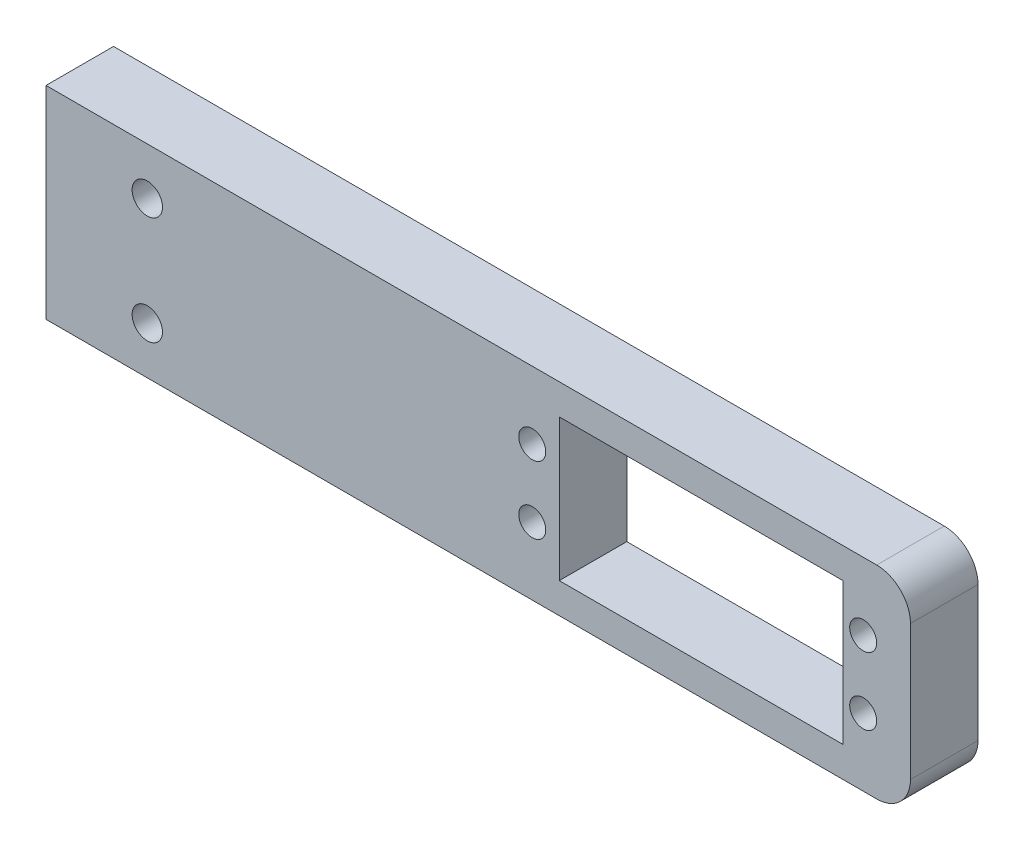
ISO-10303-21;
HEADER;
FILE_DESCRIPTION(('STEP AP214'),'2;1');
FILE_NAME('part.step','',(''),(''),'','','');
FILE_SCHEMA(('AUTOMOTIVE_DESIGN { 1 0 10303 214 1 1 1 1 }'));
ENDSEC;
DATA;
#1=APPLICATION_CONTEXT('core data for automotive mechanical design processes');
#2=APPLICATION_PROTOCOL_DEFINITION('international standard','automotive_design',2000,#1);
#3=PRODUCT_CONTEXT('',#1,'mechanical');
#4=PRODUCT('Part','Part','',(#3));
#5=PRODUCT_RELATED_PRODUCT_CATEGORY('part','',(#4));
#6=PRODUCT_DEFINITION_FORMATION('','',#4);
#7=PRODUCT_DEFINITION_CONTEXT('part definition',#1,'design');
#8=PRODUCT_DEFINITION('design','',#6,#7);
#9=PRODUCT_DEFINITION_SHAPE('','',#8);
#10=(LENGTH_UNIT() NAMED_UNIT(*) SI_UNIT(.MILLI.,.METRE.));
#11=(NAMED_UNIT(*) PLANE_ANGLE_UNIT() SI_UNIT($,.RADIAN.));
#12=(NAMED_UNIT(*) SI_UNIT($,.STERADIAN.) SOLID_ANGLE_UNIT());
#13=UNCERTAINTY_MEASURE_WITH_UNIT(LENGTH_MEASURE(1.E-05),#10,'distance_accuracy_value','');
#14=(GEOMETRIC_REPRESENTATION_CONTEXT(3) GLOBAL_UNCERTAINTY_ASSIGNED_CONTEXT((#13)) GLOBAL_UNIT_ASSIGNED_CONTEXT((#10,
#11,#12)) REPRESENTATION_CONTEXT('',''));
#15=CARTESIAN_POINT('',(0.,0.,0.));
#16=DIRECTION('',(0.,0.,1.));
#17=DIRECTION('',(1.,0.,0.));
#18=AXIS2_PLACEMENT_3D('',#15,#16,#17);
#19=CARTESIAN_POINT('',(0.,0.,10.));
#20=DIRECTION('',(1.,0.,0.));
#21=DIRECTION('',(0.,0.,-1.));
#22=AXIS2_PLACEMENT_3D('',#19,#20,#21);
#23=PLANE('',#22);
#24=DIRECTION('',(0.,-1.,0.));
#25=VECTOR('',#24,1.);
#26=CARTESIAN_POINT('',(0.,0.,0.));
#27=LINE('',#26,#25);
#28=CARTESIAN_POINT('',(0.,30.,0.));
#29=VERTEX_POINT('',#28);
#30=CARTESIAN_POINT('',(0.,0.,0.));
#31=VERTEX_POINT('',#30);
#32=EDGE_CURVE('E171',#29,#31,#27,.T.);
#33=ORIENTED_EDGE('',*,*,#32,.T.);
#34=DIRECTION('',(0.,0.,-1.));
#35=VECTOR('',#34,1.);
#36=CARTESIAN_POINT('',(0.,0.,10.));
#37=LINE('',#36,#35);
#38=CARTESIAN_POINT('',(0.,0.,10.));
#39=VERTEX_POINT('',#38);
#40=EDGE_CURVE('E207',#39,#31,#37,.T.);
#41=ORIENTED_EDGE('',*,*,#40,.F.);
#42=DIRECTION('',(0.,-1.,0.));
#43=VECTOR('',#42,1.);
#44=CARTESIAN_POINT('',(0.,0.,10.));
#45=LINE('',#44,#43);
#46=CARTESIAN_POINT('',(0.,30.,10.));
#47=VERTEX_POINT('',#46);
#48=EDGE_CURVE('E177',#47,#39,#45,.T.);
#49=ORIENTED_EDGE('',*,*,#48,.F.);
#50=DIRECTION('',(0.,0.,-1.));
#51=VECTOR('',#50,1.);
#52=CARTESIAN_POINT('',(0.,30.,10.));
#53=LINE('',#52,#51);
#54=EDGE_CURVE('E191',#47,#29,#53,.T.);
#55=ORIENTED_EDGE('',*,*,#54,.T.);
#56=EDGE_LOOP('',(#33,#41,#49,#55));
#57=FACE_BOUND('',#56,.T.);
#58=ADVANCED_FACE('F38',(#57),#23,.F.);
#59=CARTESIAN_POINT('',(0.,0.,10.));
#60=DIRECTION('',(0.,1.,0.));
#61=DIRECTION('',(0.,0.,1.));
#62=AXIS2_PLACEMENT_3D('',#59,#60,#61);
#63=PLANE('',#62);
#64=DIRECTION('',(1.,0.,0.));
#65=VECTOR('',#64,1.);
#66=CARTESIAN_POINT('',(0.,0.,0.));
#67=LINE('',#66,#65);
#68=CARTESIAN_POINT('',(123.,0.,0.));
#69=VERTEX_POINT('',#68);
#70=EDGE_CURVE('E195',#31,#69,#67,.T.);
#71=ORIENTED_EDGE('',*,*,#70,.T.);
#72=DIRECTION('',(0.,0.,-1.));
#73=VECTOR('',#72,1.);
#74=CARTESIAN_POINT('',(123.,0.,10.));
#75=LINE('',#74,#73);
#76=CARTESIAN_POINT('',(123.,0.,10.));
#77=VERTEX_POINT('',#76);
#78=EDGE_CURVE('E62',#69,#77,#75,.F.);
#79=ORIENTED_EDGE('',*,*,#78,.T.);
#80=DIRECTION('',(1.,0.,0.));
#81=VECTOR('',#80,1.);
#82=CARTESIAN_POINT('',(0.,0.,10.));
#83=LINE('',#82,#81);
#84=EDGE_CURVE('E181',#39,#77,#83,.T.);
#85=ORIENTED_EDGE('',*,*,#84,.F.);
#86=ORIENTED_EDGE('',*,*,#40,.T.);
#87=EDGE_LOOP('',(#71,#79,#85,#86));
#88=FACE_BOUND('',#87,.T.);
#89=ADVANCED_FACE('F240',(#88),#63,.F.);
#90=CARTESIAN_POINT('',(128.,0.,10.));
#91=DIRECTION('',(-1.,0.,0.));
#92=DIRECTION('',(0.,0.,1.));
#93=AXIS2_PLACEMENT_3D('',#90,#91,#92);
#94=PLANE('',#93);
#95=DIRECTION('',(0.,1.,0.));
#96=VECTOR('',#95,1.);
#97=CARTESIAN_POINT('',(128.,0.,10.));
#98=LINE('',#97,#96);
#99=CARTESIAN_POINT('',(128.,5.,10.));
#100=VERTEX_POINT('',#99);
#101=CARTESIAN_POINT('',(128.,25.,10.));
#102=VERTEX_POINT('',#101);
#103=EDGE_CURVE('E185',#100,#102,#98,.T.);
#104=ORIENTED_EDGE('',*,*,#103,.F.);
#105=DIRECTION('',(0.,0.,-1.));
#106=VECTOR('',#105,1.);
#107=CARTESIAN_POINT('',(128.,5.,10.));
#108=LINE('',#107,#106);
#109=CARTESIAN_POINT('',(128.,5.,0.));
#110=VERTEX_POINT('',#109);
#111=EDGE_CURVE('E214',#100,#110,#108,.T.);
#112=ORIENTED_EDGE('',*,*,#111,.T.);
#113=DIRECTION('',(0.,1.,0.));
#114=VECTOR('',#113,1.);
#115=CARTESIAN_POINT('',(128.,0.,0.));
#116=LINE('',#115,#114);
#117=CARTESIAN_POINT('',(128.,25.,0.));
#118=VERTEX_POINT('',#117);
#119=EDGE_CURVE('E198',#110,#118,#116,.T.);
#120=ORIENTED_EDGE('',*,*,#119,.T.);
#121=DIRECTION('',(0.,0.,-1.));
#122=VECTOR('',#121,1.);
#123=CARTESIAN_POINT('',(128.,25.,10.));
#124=LINE('',#123,#122);
#125=EDGE_CURVE('E211',#118,#102,#124,.F.);
#126=ORIENTED_EDGE('',*,*,#125,.T.);
#127=EDGE_LOOP('',(#104,#112,#120,#126));
#128=FACE_BOUND('',#127,.T.);
#129=ADVANCED_FACE('F233',(#128),#94,.F.);
#130=CARTESIAN_POINT('',(0.,30.,10.));
#131=DIRECTION('',(0.,-1.,0.));
#132=DIRECTION('',(0.,0.,-1.));
#133=AXIS2_PLACEMENT_3D('',#130,#131,#132);
#134=PLANE('',#133);
#135=DIRECTION('',(-1.,0.,0.));
#136=VECTOR('',#135,1.);
#137=CARTESIAN_POINT('',(0.,30.,10.));
#138=LINE('',#137,#136);
#139=CARTESIAN_POINT('',(123.,30.,10.));
#140=VERTEX_POINT('',#139);
#141=EDGE_CURVE('E188',#140,#47,#138,.T.);
#142=ORIENTED_EDGE('',*,*,#141,.F.);
#143=DIRECTION('',(0.,0.,-1.));
#144=VECTOR('',#143,1.);
#145=CARTESIAN_POINT('',(123.,30.,10.));
#146=LINE('',#145,#144);
#147=CARTESIAN_POINT('',(123.,30.,0.));
#148=VERTEX_POINT('',#147);
#149=EDGE_CURVE('E11',#140,#148,#146,.T.);
#150=ORIENTED_EDGE('',*,*,#149,.T.);
#151=DIRECTION('',(-1.,0.,0.));
#152=VECTOR('',#151,1.);
#153=CARTESIAN_POINT('',(0.,30.,0.));
#154=LINE('',#153,#152);
#155=EDGE_CURVE('E182',#148,#29,#154,.T.);
#156=ORIENTED_EDGE('',*,*,#155,.T.);
#157=ORIENTED_EDGE('',*,*,#54,.F.);
#158=EDGE_LOOP('',(#142,#150,#156,#157));
#159=FACE_BOUND('',#158,.T.);
#160=ADVANCED_FACE('F247',(#159),#134,.F.);
#161=CARTESIAN_POINT('',(0.,0.,10.));
#162=DIRECTION('',(0.,0.,-1.));
#163=DIRECTION('',(-1.,0.,0.));
#164=AXIS2_PLACEMENT_3D('',#161,#162,#163);
#165=PLANE('',#164);
#166=CARTESIAN_POINT('',(15.,23.,10.));
#167=DIRECTION('',(0.,0.,1.));
#168=DIRECTION('',(1.,0.,0.));
#169=AXIS2_PLACEMENT_3D('',#166,#167,#168);
#170=CIRCLE('',#169,2.25);
#171=CARTESIAN_POINT('',(17.25,23.,10.));
#172=VERTEX_POINT('',#171);
#173=EDGE_CURVE('E314',#172,#172,#170,.T.);
#174=ORIENTED_EDGE('',*,*,#173,.F.);
#175=EDGE_LOOP('',(#174));
#176=FACE_BOUND('',#175,.T.);
#177=CARTESIAN_POINT('',(15.,7.,10.));
#178=DIRECTION('',(0.,0.,1.));
#179=DIRECTION('',(1.,0.,0.));
#180=AXIS2_PLACEMENT_3D('',#177,#178,#179);
#181=CIRCLE('',#180,2.25);
#182=CARTESIAN_POINT('',(17.25,7.,10.));
#183=VERTEX_POINT('',#182);
#184=EDGE_CURVE('E322',#183,#183,#181,.T.);
#185=ORIENTED_EDGE('',*,*,#184,.F.);
#186=EDGE_LOOP('',(#185));
#187=FACE_BOUND('',#186,.T.);
#188=CARTESIAN_POINT('',(72.,20.,10.));
#189=DIRECTION('',(0.,0.,-1.));
#190=DIRECTION('',(-1.,0.,0.));
#191=AXIS2_PLACEMENT_3D('',#188,#189,#190);
#192=CIRCLE('',#191,2.);
#193=CARTESIAN_POINT('',(70.,20.,10.));
#194=VERTEX_POINT('',#193);
#195=EDGE_CURVE('E350',#194,#194,#192,.T.);
#196=ORIENTED_EDGE('',*,*,#195,.T.);
#197=EDGE_LOOP('',(#196));
#198=FACE_BOUND('',#197,.T.);
#199=CARTESIAN_POINT('',(72.,10.,10.));
#200=DIRECTION('',(0.,0.,-1.));
#201=DIRECTION('',(-1.,0.,0.));
#202=AXIS2_PLACEMENT_3D('',#199,#200,#201);
#203=CIRCLE('',#202,2.);
#204=CARTESIAN_POINT('',(70.,10.,10.));
#205=VERTEX_POINT('',#204);
#206=EDGE_CURVE('E343',#205,#205,#203,.T.);
#207=ORIENTED_EDGE('',*,*,#206,.T.);
#208=EDGE_LOOP('',(#207));
#209=FACE_BOUND('',#208,.T.);
#210=CARTESIAN_POINT('',(121.,20.,10.));
#211=DIRECTION('',(0.,0.,-1.));
#212=DIRECTION('',(-1.,0.,0.));
#213=AXIS2_PLACEMENT_3D('',#210,#211,#212);
#214=CIRCLE('',#213,2.);
#215=CARTESIAN_POINT('',(119.,20.,10.));
#216=VERTEX_POINT('',#215);
#217=EDGE_CURVE('E335',#216,#216,#214,.T.);
#218=ORIENTED_EDGE('',*,*,#217,.T.);
#219=EDGE_LOOP('',(#218));
#220=FACE_BOUND('',#219,.T.);
#221=CARTESIAN_POINT('',(121.,10.,10.));
#222=DIRECTION('',(0.,0.,-1.));
#223=DIRECTION('',(-1.,0.,0.));
#224=AXIS2_PLACEMENT_3D('',#221,#222,#223);
#225=CIRCLE('',#224,2.);
#226=CARTESIAN_POINT('',(119.,10.,10.));
#227=VERTEX_POINT('',#226);
#228=EDGE_CURVE('E162',#227,#227,#225,.T.);
#229=ORIENTED_EDGE('',*,*,#228,.T.);
#230=EDGE_LOOP('',(#229));
#231=FACE_BOUND('',#230,.T.);
#232=DIRECTION('',(1.,0.,0.));
#233=VECTOR('',#232,1.);
#234=CARTESIAN_POINT('',(118.,25.5,10.));
#235=LINE('',#234,#233);
#236=CARTESIAN_POINT('',(76.,25.5,10.));
#237=VERTEX_POINT('',#236);
#238=CARTESIAN_POINT('',(118.,25.5,10.));
#239=VERTEX_POINT('',#238);
#240=EDGE_CURVE('E131',#237,#239,#235,.T.);
#241=ORIENTED_EDGE('',*,*,#240,.T.);
#242=DIRECTION('',(0.,-1.,0.));
#243=VECTOR('',#242,1.);
#244=CARTESIAN_POINT('',(118.,4.5,10.));
#245=LINE('',#244,#243);
#246=CARTESIAN_POINT('',(118.,4.5,10.));
#247=VERTEX_POINT('',#246);
#248=EDGE_CURVE('E122',#239,#247,#245,.T.);
#249=ORIENTED_EDGE('',*,*,#248,.T.);
#250=DIRECTION('',(-1.,0.,0.));
#251=VECTOR('',#250,1.);
#252=CARTESIAN_POINT('',(118.,4.5,10.));
#253=LINE('',#252,#251);
#254=CARTESIAN_POINT('',(76.,4.5,10.));
#255=VERTEX_POINT('',#254);
#256=EDGE_CURVE('E135',#247,#255,#253,.T.);
#257=ORIENTED_EDGE('',*,*,#256,.T.);
#258=DIRECTION('',(0.,1.,0.));
#259=VECTOR('',#258,1.);
#260=CARTESIAN_POINT('',(76.,4.5,10.));
#261=LINE('',#260,#259);
#262=EDGE_CURVE('E140',#255,#237,#261,.T.);
#263=ORIENTED_EDGE('',*,*,#262,.T.);
#264=EDGE_LOOP('',(#241,#249,#257,#263));
#265=FACE_BOUND('',#264,.T.);
#266=ORIENTED_EDGE('',*,*,#84,.T.);
#267=CARTESIAN_POINT('',(123.,5.,10.));
#268=DIRECTION('',(0.,0.,-1.));
#269=DIRECTION('',(-1.,0.,0.));
#270=AXIS2_PLACEMENT_3D('',#267,#268,#269);
#271=CIRCLE('',#270,5.);
#272=EDGE_CURVE('E47',#77,#100,#271,.F.);
#273=ORIENTED_EDGE('',*,*,#272,.T.);
#274=ORIENTED_EDGE('',*,*,#103,.T.);
#275=CARTESIAN_POINT('',(123.,25.,10.));
#276=DIRECTION('',(0.,0.,-1.));
#277=DIRECTION('',(-1.,0.,0.));
#278=AXIS2_PLACEMENT_3D('',#275,#276,#277);
#279=CIRCLE('',#278,5.);
#280=EDGE_CURVE('E54',#102,#140,#279,.F.);
#281=ORIENTED_EDGE('',*,*,#280,.T.);
#282=ORIENTED_EDGE('',*,*,#141,.T.);
#283=ORIENTED_EDGE('',*,*,#48,.T.);
#284=EDGE_LOOP('',(#266,#273,#274,#281,#282,#283));
#285=FACE_BOUND('',#284,.T.);
#286=ADVANCED_FACE('F142',(#176,#187,#198,#209,#220,#231,#265,#285),#165,.F.);
#287=CARTESIAN_POINT('',(0.,0.,0.));
#288=DIRECTION('',(0.,0.,-1.));
#289=DIRECTION('',(-1.,0.,0.));
#290=AXIS2_PLACEMENT_3D('',#287,#288,#289);
#291=PLANE('',#290);
#292=CARTESIAN_POINT('',(15.,23.,0.));
#293=DIRECTION('',(0.,0.,1.));
#294=DIRECTION('',(1.,0.,0.));
#295=AXIS2_PLACEMENT_3D('',#292,#293,#294);
#296=CIRCLE('',#295,2.25);
#297=CARTESIAN_POINT('',(17.25,23.,0.));
#298=VERTEX_POINT('',#297);
#299=EDGE_CURVE('E311',#298,#298,#296,.T.);
#300=ORIENTED_EDGE('',*,*,#299,.T.);
#301=EDGE_LOOP('',(#300));
#302=FACE_BOUND('',#301,.T.);
#303=CARTESIAN_POINT('',(15.,7.,0.));
#304=DIRECTION('',(0.,0.,1.));
#305=DIRECTION('',(1.,0.,0.));
#306=AXIS2_PLACEMENT_3D('',#303,#304,#305);
#307=CIRCLE('',#306,2.25);
#308=CARTESIAN_POINT('',(17.25,7.,0.));
#309=VERTEX_POINT('',#308);
#310=EDGE_CURVE('E316',#309,#309,#307,.T.);
#311=ORIENTED_EDGE('',*,*,#310,.T.);
#312=EDGE_LOOP('',(#311));
#313=FACE_BOUND('',#312,.T.);
#314=CARTESIAN_POINT('',(72.,20.,0.));
#315=DIRECTION('',(0.,0.,-1.));
#316=DIRECTION('',(-1.,0.,0.));
#317=AXIS2_PLACEMENT_3D('',#314,#315,#316);
#318=CIRCLE('',#317,2.);
#319=CARTESIAN_POINT('',(70.,20.,0.));
#320=VERTEX_POINT('',#319);
#321=EDGE_CURVE('E152',#320,#320,#318,.T.);
#322=ORIENTED_EDGE('',*,*,#321,.F.);
#323=EDGE_LOOP('',(#322));
#324=FACE_BOUND('',#323,.T.);
#325=CARTESIAN_POINT('',(72.,10.,0.));
#326=DIRECTION('',(0.,0.,-1.));
#327=DIRECTION('',(-1.,0.,0.));
#328=AXIS2_PLACEMENT_3D('',#325,#326,#327);
#329=CIRCLE('',#328,2.);
#330=CARTESIAN_POINT('',(70.,10.,0.));
#331=VERTEX_POINT('',#330);
#332=EDGE_CURVE('E347',#331,#331,#329,.T.);
#333=ORIENTED_EDGE('',*,*,#332,.F.);
#334=EDGE_LOOP('',(#333));
#335=FACE_BOUND('',#334,.T.);
#336=CARTESIAN_POINT('',(121.,20.,0.));
#337=DIRECTION('',(0.,0.,-1.));
#338=DIRECTION('',(-1.,0.,0.));
#339=AXIS2_PLACEMENT_3D('',#336,#337,#338);
#340=CIRCLE('',#339,2.);
#341=CARTESIAN_POINT('',(119.,20.,0.));
#342=VERTEX_POINT('',#341);
#343=EDGE_CURVE('E339',#342,#342,#340,.T.);
#344=ORIENTED_EDGE('',*,*,#343,.F.);
#345=EDGE_LOOP('',(#344));
#346=FACE_BOUND('',#345,.T.);
#347=CARTESIAN_POINT('',(121.,10.,0.));
#348=DIRECTION('',(0.,0.,-1.));
#349=DIRECTION('',(-1.,0.,0.));
#350=AXIS2_PLACEMENT_3D('',#347,#348,#349);
#351=CIRCLE('',#350,2.);
#352=CARTESIAN_POINT('',(119.,10.,0.));
#353=VERTEX_POINT('',#352);
#354=EDGE_CURVE('E331',#353,#353,#351,.T.);
#355=ORIENTED_EDGE('',*,*,#354,.F.);
#356=EDGE_LOOP('',(#355));
#357=FACE_BOUND('',#356,.T.);
#358=DIRECTION('',(0.,-1.,0.));
#359=VECTOR('',#358,1.);
#360=CARTESIAN_POINT('',(118.,4.5,0.));
#361=LINE('',#360,#359);
#362=CARTESIAN_POINT('',(118.,25.5,0.));
#363=VERTEX_POINT('',#362);
#364=CARTESIAN_POINT('',(118.,4.5,0.));
#365=VERTEX_POINT('',#364);
#366=EDGE_CURVE('E125',#363,#365,#361,.T.);
#367=ORIENTED_EDGE('',*,*,#366,.F.);
#368=DIRECTION('',(1.,0.,0.));
#369=VECTOR('',#368,1.);
#370=CARTESIAN_POINT('',(118.,25.5,0.));
#371=LINE('',#370,#369);
#372=CARTESIAN_POINT('',(76.,25.5,0.));
#373=VERTEX_POINT('',#372);
#374=EDGE_CURVE('E145',#373,#363,#371,.T.);
#375=ORIENTED_EDGE('',*,*,#374,.F.);
#376=DIRECTION('',(0.,1.,0.));
#377=VECTOR('',#376,1.);
#378=CARTESIAN_POINT('',(76.,4.5,0.));
#379=LINE('',#378,#377);
#380=CARTESIAN_POINT('',(76.,4.5,0.));
#381=VERTEX_POINT('',#380);
#382=EDGE_CURVE('E149',#381,#373,#379,.T.);
#383=ORIENTED_EDGE('',*,*,#382,.F.);
#384=DIRECTION('',(-1.,0.,0.));
#385=VECTOR('',#384,1.);
#386=CARTESIAN_POINT('',(118.,4.5,0.));
#387=LINE('',#386,#385);
#388=EDGE_CURVE('E161',#365,#381,#387,.T.);
#389=ORIENTED_EDGE('',*,*,#388,.F.);
#390=EDGE_LOOP('',(#367,#375,#383,#389));
#391=FACE_BOUND('',#390,.T.);
#392=ORIENTED_EDGE('',*,*,#119,.F.);
#393=CARTESIAN_POINT('',(123.,5.,0.));
#394=DIRECTION('',(0.,0.,-1.));
#395=DIRECTION('',(-1.,0.,0.));
#396=AXIS2_PLACEMENT_3D('',#393,#394,#395);
#397=CIRCLE('',#396,5.);
#398=EDGE_CURVE('E221',#110,#69,#397,.T.);
#399=ORIENTED_EDGE('',*,*,#398,.T.);
#400=ORIENTED_EDGE('',*,*,#70,.F.);
#401=ORIENTED_EDGE('',*,*,#32,.F.);
#402=ORIENTED_EDGE('',*,*,#155,.F.);
#403=CARTESIAN_POINT('',(123.,25.,0.));
#404=DIRECTION('',(0.,0.,-1.));
#405=DIRECTION('',(-1.,0.,0.));
#406=AXIS2_PLACEMENT_3D('',#403,#404,#405);
#407=CIRCLE('',#406,5.);
#408=EDGE_CURVE('E218',#148,#118,#407,.T.);
#409=ORIENTED_EDGE('',*,*,#408,.T.);
#410=EDGE_LOOP('',(#392,#399,#400,#401,#402,#409));
#411=FACE_BOUND('',#410,.T.);
#412=ADVANCED_FACE('F238',(#302,#313,#324,#335,#346,#357,#391,#411),#291,.T.);
#413=CARTESIAN_POINT('',(118.,4.5,10.));
#414=DIRECTION('',(1.,0.,0.));
#415=DIRECTION('',(0.,0.,-1.));
#416=AXIS2_PLACEMENT_3D('',#413,#414,#415);
#417=PLANE('',#416);
#418=ORIENTED_EDGE('',*,*,#366,.T.);
#419=DIRECTION('',(0.,0.,-1.));
#420=VECTOR('',#419,1.);
#421=CARTESIAN_POINT('',(118.,4.5,10.));
#422=LINE('',#421,#420);
#423=EDGE_CURVE('E118',#247,#365,#422,.T.);
#424=ORIENTED_EDGE('',*,*,#423,.F.);
#425=ORIENTED_EDGE('',*,*,#248,.F.);
#426=DIRECTION('',(0.,0.,-1.));
#427=VECTOR('',#426,1.);
#428=CARTESIAN_POINT('',(118.,25.5,10.));
#429=LINE('',#428,#427);
#430=EDGE_CURVE('E168',#239,#363,#429,.T.);
#431=ORIENTED_EDGE('',*,*,#430,.T.);
#432=EDGE_LOOP('',(#418,#424,#425,#431));
#433=FACE_BOUND('',#432,.T.);
#434=ADVANCED_FACE('F120',(#433),#417,.F.);
#435=CARTESIAN_POINT('',(118.,25.5,10.));
#436=DIRECTION('',(0.,1.,0.));
#437=DIRECTION('',(0.,0.,1.));
#438=AXIS2_PLACEMENT_3D('',#435,#436,#437);
#439=PLANE('',#438);
#440=ORIENTED_EDGE('',*,*,#374,.T.);
#441=ORIENTED_EDGE('',*,*,#430,.F.);
#442=ORIENTED_EDGE('',*,*,#240,.F.);
#443=DIRECTION('',(0.,0.,-1.));
#444=VECTOR('',#443,1.);
#445=CARTESIAN_POINT('',(76.,25.5,10.));
#446=LINE('',#445,#444);
#447=EDGE_CURVE('E172',#237,#373,#446,.T.);
#448=ORIENTED_EDGE('',*,*,#447,.T.);
#449=EDGE_LOOP('',(#440,#441,#442,#448));
#450=FACE_BOUND('',#449,.T.);
#451=ADVANCED_FACE('F279',(#450),#439,.F.);
#452=CARTESIAN_POINT('',(76.,4.5,10.));
#453=DIRECTION('',(-1.,0.,0.));
#454=DIRECTION('',(0.,0.,1.));
#455=AXIS2_PLACEMENT_3D('',#452,#453,#454);
#456=PLANE('',#455);
#457=ORIENTED_EDGE('',*,*,#382,.T.);
#458=ORIENTED_EDGE('',*,*,#447,.F.);
#459=ORIENTED_EDGE('',*,*,#262,.F.);
#460=DIRECTION('',(0.,0.,-1.));
#461=VECTOR('',#460,1.);
#462=CARTESIAN_POINT('',(76.,4.5,10.));
#463=LINE('',#462,#461);
#464=EDGE_CURVE('E130',#255,#381,#463,.T.);
#465=ORIENTED_EDGE('',*,*,#464,.T.);
#466=EDGE_LOOP('',(#457,#458,#459,#465));
#467=FACE_BOUND('',#466,.T.);
#468=ADVANCED_FACE('F283',(#467),#456,.F.);
#469=CARTESIAN_POINT('',(118.,4.5,10.));
#470=DIRECTION('',(0.,-1.,0.));
#471=DIRECTION('',(0.,0.,-1.));
#472=AXIS2_PLACEMENT_3D('',#469,#470,#471);
#473=PLANE('',#472);
#474=ORIENTED_EDGE('',*,*,#388,.T.);
#475=ORIENTED_EDGE('',*,*,#464,.F.);
#476=ORIENTED_EDGE('',*,*,#256,.F.);
#477=ORIENTED_EDGE('',*,*,#423,.T.);
#478=EDGE_LOOP('',(#474,#475,#476,#477));
#479=FACE_BOUND('',#478,.T.);
#480=ADVANCED_FACE('F136',(#479),#473,.F.);
#481=CARTESIAN_POINT('',(121.,10.,10.));
#482=DIRECTION('',(0.,0.,-1.));
#483=DIRECTION('',(-1.,0.,0.));
#484=AXIS2_PLACEMENT_3D('',#481,#482,#483);
#485=CYLINDRICAL_SURFACE('',#484,2.);
#486=ORIENTED_EDGE('',*,*,#228,.F.);
#487=EDGE_LOOP('',(#486));
#488=FACE_BOUND('',#487,.T.);
#489=ORIENTED_EDGE('',*,*,#354,.T.);
#490=EDGE_LOOP('',(#489));
#491=FACE_BOUND('',#490,.T.);
#492=ADVANCED_FACE('F282',(#488,#491),#485,.F.);
#493=CARTESIAN_POINT('',(121.,20.,10.));
#494=DIRECTION('',(0.,0.,-1.));
#495=DIRECTION('',(-1.,0.,0.));
#496=AXIS2_PLACEMENT_3D('',#493,#494,#495);
#497=CYLINDRICAL_SURFACE('',#496,2.);
#498=ORIENTED_EDGE('',*,*,#217,.F.);
#499=EDGE_LOOP('',(#498));
#500=FACE_BOUND('',#499,.T.);
#501=ORIENTED_EDGE('',*,*,#343,.T.);
#502=EDGE_LOOP('',(#501));
#503=FACE_BOUND('',#502,.T.);
#504=ADVANCED_FACE('F296',(#500,#503),#497,.F.);
#505=CARTESIAN_POINT('',(72.,10.,10.));
#506=DIRECTION('',(0.,0.,-1.));
#507=DIRECTION('',(-1.,0.,0.));
#508=AXIS2_PLACEMENT_3D('',#505,#506,#507);
#509=CYLINDRICAL_SURFACE('',#508,2.);
#510=ORIENTED_EDGE('',*,*,#206,.F.);
#511=EDGE_LOOP('',(#510));
#512=FACE_BOUND('',#511,.T.);
#513=ORIENTED_EDGE('',*,*,#332,.T.);
#514=EDGE_LOOP('',(#513));
#515=FACE_BOUND('',#514,.T.);
#516=ADVANCED_FACE('F292',(#512,#515),#509,.F.);
#517=CARTESIAN_POINT('',(72.,20.,10.));
#518=DIRECTION('',(0.,0.,-1.));
#519=DIRECTION('',(-1.,0.,0.));
#520=AXIS2_PLACEMENT_3D('',#517,#518,#519);
#521=CYLINDRICAL_SURFACE('',#520,2.);
#522=ORIENTED_EDGE('',*,*,#195,.F.);
#523=EDGE_LOOP('',(#522));
#524=FACE_BOUND('',#523,.T.);
#525=ORIENTED_EDGE('',*,*,#321,.T.);
#526=EDGE_LOOP('',(#525));
#527=FACE_BOUND('',#526,.T.);
#528=ADVANCED_FACE('F259',(#524,#527),#521,.F.);
#529=CARTESIAN_POINT('',(123.,5.,10.));
#530=DIRECTION('',(0.,0.,-1.));
#531=DIRECTION('',(-1.,0.,0.));
#532=AXIS2_PLACEMENT_3D('',#529,#530,#531);
#533=CYLINDRICAL_SURFACE('',#532,5.);
#534=ORIENTED_EDGE('',*,*,#272,.F.);
#535=ORIENTED_EDGE('',*,*,#78,.F.);
#536=ORIENTED_EDGE('',*,*,#398,.F.);
#537=ORIENTED_EDGE('',*,*,#111,.F.);
#538=EDGE_LOOP('',(#534,#535,#536,#537));
#539=FACE_BOUND('',#538,.T.);
#540=ADVANCED_FACE('F236',(#539),#533,.T.);
#541=CARTESIAN_POINT('',(123.,25.,10.));
#542=DIRECTION('',(0.,0.,-1.));
#543=DIRECTION('',(-1.,0.,0.));
#544=AXIS2_PLACEMENT_3D('',#541,#542,#543);
#545=CYLINDRICAL_SURFACE('',#544,5.);
#546=ORIENTED_EDGE('',*,*,#280,.F.);
#547=ORIENTED_EDGE('',*,*,#125,.F.);
#548=ORIENTED_EDGE('',*,*,#408,.F.);
#549=ORIENTED_EDGE('',*,*,#149,.F.);
#550=EDGE_LOOP('',(#546,#547,#548,#549));
#551=FACE_BOUND('',#550,.T.);
#552=ADVANCED_FACE('F40',(#551),#545,.T.);
#553=CARTESIAN_POINT('',(15.,7.,0.));
#554=DIRECTION('',(0.,0.,1.));
#555=DIRECTION('',(1.,0.,0.));
#556=AXIS2_PLACEMENT_3D('',#553,#554,#555);
#557=CYLINDRICAL_SURFACE('',#556,2.25);
#558=ORIENTED_EDGE('',*,*,#310,.F.);
#559=EDGE_LOOP('',(#558));
#560=FACE_BOUND('',#559,.T.);
#561=ORIENTED_EDGE('',*,*,#184,.T.);
#562=EDGE_LOOP('',(#561));
#563=FACE_BOUND('',#562,.T.);
#564=ADVANCED_FACE('F251',(#560,#563),#557,.F.);
#565=CARTESIAN_POINT('',(15.,23.,0.));
#566=DIRECTION('',(0.,0.,1.));
#567=DIRECTION('',(1.,0.,0.));
#568=AXIS2_PLACEMENT_3D('',#565,#566,#567);
#569=CYLINDRICAL_SURFACE('',#568,2.25);
#570=ORIENTED_EDGE('',*,*,#299,.F.);
#571=EDGE_LOOP('',(#570));
#572=FACE_BOUND('',#571,.T.);
#573=ORIENTED_EDGE('',*,*,#173,.T.);
#574=EDGE_LOOP('',(#573));
#575=FACE_BOUND('',#574,.T.);
#576=ADVANCED_FACE('F256',(#572,#575),#569,.F.);
#577=CLOSED_SHELL('',(#58,#89,#129,#160,#286,#412,#434,#451,#468,#480,#492,#504,#516,#528,#540,
#552,#564,#576));
#578=MANIFOLD_SOLID_BREP('B2',#577);
#579=ADVANCED_BREP_SHAPE_REPRESENTATION('',(#18,#578),#14);
#580=SHAPE_DEFINITION_REPRESENTATION(#9,#579);
ENDSEC;
END-ISO-10303-21;
